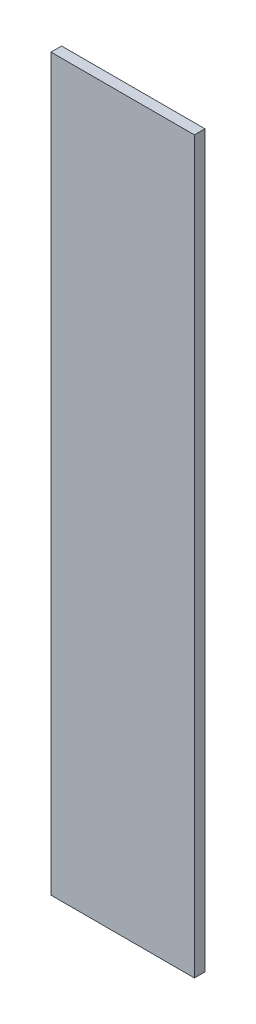
ISO-10303-21;
HEADER;
FILE_DESCRIPTION(('STEP AP214'),'2;1');
FILE_NAME('part.step','',(''),(''),'','','');
FILE_SCHEMA(('AUTOMOTIVE_DESIGN { 1 0 10303 214 1 1 1 1 }'));
ENDSEC;
DATA;
#1=APPLICATION_CONTEXT('core data for automotive mechanical design processes');
#2=APPLICATION_PROTOCOL_DEFINITION('international standard','automotive_design',2000,#1);
#3=PRODUCT_CONTEXT('',#1,'mechanical');
#4=PRODUCT('Part','Part','',(#3));
#5=PRODUCT_RELATED_PRODUCT_CATEGORY('part','',(#4));
#6=PRODUCT_DEFINITION_FORMATION('','',#4);
#7=PRODUCT_DEFINITION_CONTEXT('part definition',#1,'design');
#8=PRODUCT_DEFINITION('design','',#6,#7);
#9=PRODUCT_DEFINITION_SHAPE('','',#8);
#10=(LENGTH_UNIT() NAMED_UNIT(*) SI_UNIT(.MILLI.,.METRE.));
#11=(NAMED_UNIT(*) PLANE_ANGLE_UNIT() SI_UNIT($,.RADIAN.));
#12=(NAMED_UNIT(*) SI_UNIT($,.STERADIAN.) SOLID_ANGLE_UNIT());
#13=UNCERTAINTY_MEASURE_WITH_UNIT(LENGTH_MEASURE(1.E-05),#10,'distance_accuracy_value','');
#14=(GEOMETRIC_REPRESENTATION_CONTEXT(3) GLOBAL_UNCERTAINTY_ASSIGNED_CONTEXT((#13)) GLOBAL_UNIT_ASSIGNED_CONTEXT((#10,
#11,#12)) REPRESENTATION_CONTEXT('',''));
#15=CARTESIAN_POINT('',(0.,0.,0.));
#16=DIRECTION('',(0.,0.,1.));
#17=DIRECTION('',(1.,0.,0.));
#18=AXIS2_PLACEMENT_3D('',#15,#16,#17);
#19=CARTESIAN_POINT('',(0.,0.,1.016));
#20=DIRECTION('',(0.,1.,0.));
#21=DIRECTION('',(0.,0.,1.));
#22=AXIS2_PLACEMENT_3D('',#19,#20,#21);
#23=PLANE('',#22);
#24=DIRECTION('',(1.,0.,0.));
#25=VECTOR('',#24,1.);
#26=CARTESIAN_POINT('',(0.,0.,0.));
#27=LINE('',#26,#25);
#28=CARTESIAN_POINT('',(0.,0.,0.));
#29=VERTEX_POINT('',#28);
#30=CARTESIAN_POINT('',(13.79140625,0.,0.));
#31=VERTEX_POINT('',#30);
#32=EDGE_CURVE('E113',#29,#31,#27,.T.);
#33=ORIENTED_EDGE('',*,*,#32,.T.);
#34=DIRECTION('',(0.,0.,-1.));
#35=VECTOR('',#34,1.);
#36=CARTESIAN_POINT('',(13.79140625,0.,1.016));
#37=LINE('',#36,#35);
#38=CARTESIAN_POINT('',(13.79140625,0.,1.016));
#39=VERTEX_POINT('',#38);
#40=EDGE_CURVE('E11',#39,#31,#37,.T.);
#41=ORIENTED_EDGE('',*,*,#40,.F.);
#42=DIRECTION('',(1.,0.,0.));
#43=VECTOR('',#42,1.);
#44=CARTESIAN_POINT('',(0.,0.,1.016));
#45=LINE('',#44,#43);
#46=CARTESIAN_POINT('',(0.,0.,1.016));
#47=VERTEX_POINT('',#46);
#48=EDGE_CURVE('E95',#47,#39,#45,.T.);
#49=ORIENTED_EDGE('',*,*,#48,.F.);
#50=DIRECTION('',(0.,0.,-1.));
#51=VECTOR('',#50,1.);
#52=CARTESIAN_POINT('',(0.,0.,1.016));
#53=LINE('',#52,#51);
#54=EDGE_CURVE('E62',#47,#29,#53,.T.);
#55=ORIENTED_EDGE('',*,*,#54,.T.);
#56=EDGE_LOOP('',(#33,#41,#49,#55));
#57=FACE_BOUND('',#56,.T.);
#58=ADVANCED_FACE('F45',(#57),#23,.F.);
#59=CARTESIAN_POINT('',(13.79140625,0.,1.016));
#60=DIRECTION('',(-1.,0.,0.));
#61=DIRECTION('',(0.,0.,1.));
#62=AXIS2_PLACEMENT_3D('',#59,#60,#61);
#63=PLANE('',#62);
#64=DIRECTION('',(0.,1.,0.));
#65=VECTOR('',#64,1.);
#66=CARTESIAN_POINT('',(13.79140625,0.,0.));
#67=LINE('',#66,#65);
#68=CARTESIAN_POINT('',(13.79140625,70.241848594,0.));
#69=VERTEX_POINT('',#68);
#70=EDGE_CURVE('E101',#31,#69,#67,.T.);
#71=ORIENTED_EDGE('',*,*,#70,.T.);
#72=DIRECTION('',(0.,0.,-1.));
#73=VECTOR('',#72,1.);
#74=CARTESIAN_POINT('',(13.79140625,70.241848594,1.016));
#75=LINE('',#74,#73);
#76=CARTESIAN_POINT('',(13.79140625,70.241848594,1.016));
#77=VERTEX_POINT('',#76);
#78=EDGE_CURVE('E54',#77,#69,#75,.T.);
#79=ORIENTED_EDGE('',*,*,#78,.F.);
#80=DIRECTION('',(0.,1.,0.));
#81=VECTOR('',#80,1.);
#82=CARTESIAN_POINT('',(13.79140625,0.,1.016));
#83=LINE('',#82,#81);
#84=EDGE_CURVE('E87',#39,#77,#83,.T.);
#85=ORIENTED_EDGE('',*,*,#84,.F.);
#86=ORIENTED_EDGE('',*,*,#40,.T.);
#87=EDGE_LOOP('',(#71,#79,#85,#86));
#88=FACE_BOUND('',#87,.T.);
#89=ADVANCED_FACE('F100',(#88),#63,.F.);
#90=CARTESIAN_POINT('',(0.,70.241848594,1.016));
#91=DIRECTION('',(0.,1.,0.));
#92=DIRECTION('',(0.,0.,1.));
#93=AXIS2_PLACEMENT_3D('',#90,#91,#92);
#94=PLANE('',#93);
#95=DIRECTION('',(1.,0.,0.));
#96=VECTOR('',#95,1.);
#97=CARTESIAN_POINT('',(0.,70.241848594,0.));
#98=LINE('',#97,#96);
#99=CARTESIAN_POINT('',(0.,70.241848594,0.));
#100=VERTEX_POINT('',#99);
#101=EDGE_CURVE('E118',#100,#69,#98,.T.);
#102=ORIENTED_EDGE('',*,*,#101,.F.);
#103=DIRECTION('',(0.,0.,-1.));
#104=VECTOR('',#103,1.);
#105=CARTESIAN_POINT('',(0.,70.241848594,1.016));
#106=LINE('',#105,#104);
#107=CARTESIAN_POINT('',(0.,70.241848594,1.016));
#108=VERTEX_POINT('',#107);
#109=EDGE_CURVE('E76',#108,#100,#106,.T.);
#110=ORIENTED_EDGE('',*,*,#109,.F.);
#111=DIRECTION('',(1.,0.,0.));
#112=VECTOR('',#111,1.);
#113=CARTESIAN_POINT('',(0.,70.241848594,1.016));
#114=LINE('',#113,#112);
#115=EDGE_CURVE('E94',#108,#77,#114,.T.);
#116=ORIENTED_EDGE('',*,*,#115,.T.);
#117=ORIENTED_EDGE('',*,*,#78,.T.);
#118=EDGE_LOOP('',(#102,#110,#116,#117));
#119=FACE_BOUND('',#118,.T.);
#120=ADVANCED_FACE('F105',(#119),#94,.T.);
#121=CARTESIAN_POINT('',(0.,0.,1.016));
#122=DIRECTION('',(-1.,0.,0.));
#123=DIRECTION('',(0.,0.,1.));
#124=AXIS2_PLACEMENT_3D('',#121,#122,#123);
#125=PLANE('',#124);
#126=DIRECTION('',(0.,1.,0.));
#127=VECTOR('',#126,1.);
#128=CARTESIAN_POINT('',(0.,0.,0.));
#129=LINE('',#128,#127);
#130=EDGE_CURVE('E121',#29,#100,#129,.T.);
#131=ORIENTED_EDGE('',*,*,#130,.F.);
#132=ORIENTED_EDGE('',*,*,#54,.F.);
#133=DIRECTION('',(0.,1.,0.));
#134=VECTOR('',#133,1.);
#135=CARTESIAN_POINT('',(0.,0.,1.016));
#136=LINE('',#135,#134);
#137=EDGE_CURVE('E107',#47,#108,#136,.T.);
#138=ORIENTED_EDGE('',*,*,#137,.T.);
#139=ORIENTED_EDGE('',*,*,#109,.T.);
#140=EDGE_LOOP('',(#131,#132,#138,#139));
#141=FACE_BOUND('',#140,.T.);
#142=ADVANCED_FACE('F131',(#141),#125,.T.);
#143=CARTESIAN_POINT('',(0.,0.,1.016));
#144=DIRECTION('',(0.,0.,1.));
#145=DIRECTION('',(1.,0.,0.));
#146=AXIS2_PLACEMENT_3D('',#143,#144,#145);
#147=PLANE('',#146);
#148=ORIENTED_EDGE('',*,*,#48,.T.);
#149=ORIENTED_EDGE('',*,*,#84,.T.);
#150=ORIENTED_EDGE('',*,*,#115,.F.);
#151=ORIENTED_EDGE('',*,*,#137,.F.);
#152=EDGE_LOOP('',(#148,#149,#150,#151));
#153=FACE_BOUND('',#152,.T.);
#154=ADVANCED_FACE('F91',(#153),#147,.T.);
#155=CARTESIAN_POINT('',(0.,0.,0.));
#156=DIRECTION('',(0.,0.,1.));
#157=DIRECTION('',(1.,0.,0.));
#158=AXIS2_PLACEMENT_3D('',#155,#156,#157);
#159=PLANE('',#158);
#160=ORIENTED_EDGE('',*,*,#32,.F.);
#161=ORIENTED_EDGE('',*,*,#130,.T.);
#162=ORIENTED_EDGE('',*,*,#101,.T.);
#163=ORIENTED_EDGE('',*,*,#70,.F.);
#164=EDGE_LOOP('',(#160,#161,#162,#163));
#165=FACE_BOUND('',#164,.T.);
#166=ADVANCED_FACE('F130',(#165),#159,.F.);
#167=CLOSED_SHELL('',(#58,#89,#120,#142,#154,#166));
#168=MANIFOLD_SOLID_BREP('B2',#167);
#169=ADVANCED_BREP_SHAPE_REPRESENTATION('',(#18,#168),#14);
#170=SHAPE_DEFINITION_REPRESENTATION(#9,#169);
ENDSEC;
END-ISO-10303-21;
